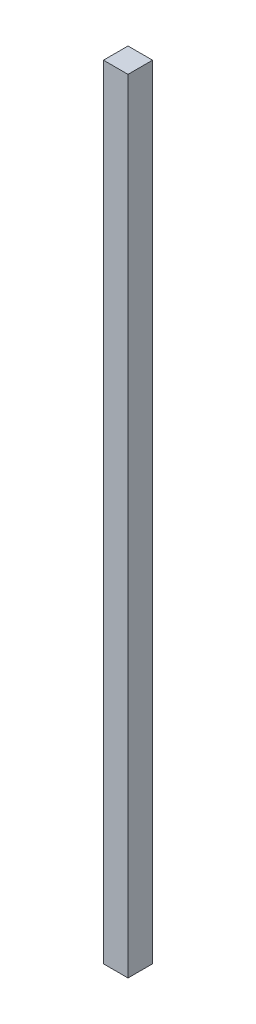
ISO-10303-21;
HEADER;
FILE_DESCRIPTION(('STEP AP214'),'2;1');
FILE_NAME('part.step','',(''),(''),'','','');
FILE_SCHEMA(('AUTOMOTIVE_DESIGN { 1 0 10303 214 1 1 1 1 }'));
ENDSEC;
DATA;
#1=APPLICATION_CONTEXT('core data for automotive mechanical design processes');
#2=APPLICATION_PROTOCOL_DEFINITION('international standard','automotive_design',2000,#1);
#3=PRODUCT_CONTEXT('',#1,'mechanical');
#4=PRODUCT('Part','Part','',(#3));
#5=PRODUCT_RELATED_PRODUCT_CATEGORY('part','',(#4));
#6=PRODUCT_DEFINITION_FORMATION('','',#4);
#7=PRODUCT_DEFINITION_CONTEXT('part definition',#1,'design');
#8=PRODUCT_DEFINITION('design','',#6,#7);
#9=PRODUCT_DEFINITION_SHAPE('','',#8);
#10=(LENGTH_UNIT() NAMED_UNIT(*) SI_UNIT(.MILLI.,.METRE.));
#11=(NAMED_UNIT(*) PLANE_ANGLE_UNIT() SI_UNIT($,.RADIAN.));
#12=(NAMED_UNIT(*) SI_UNIT($,.STERADIAN.) SOLID_ANGLE_UNIT());
#13=UNCERTAINTY_MEASURE_WITH_UNIT(LENGTH_MEASURE(1.E-05),#10,'distance_accuracy_value','');
#14=(GEOMETRIC_REPRESENTATION_CONTEXT(3) GLOBAL_UNCERTAINTY_ASSIGNED_CONTEXT((#13)) GLOBAL_UNIT_ASSIGNED_CONTEXT((#10,
#11,#12)) REPRESENTATION_CONTEXT('',''));
#15=CARTESIAN_POINT('',(0.,0.,0.));
#16=DIRECTION('',(0.,0.,1.));
#17=DIRECTION('',(1.,0.,0.));
#18=AXIS2_PLACEMENT_3D('',#15,#16,#17);
#19=CARTESIAN_POINT('',(0.,637.76,0.));
#20=DIRECTION('',(1.,0.,0.));
#21=DIRECTION('',(0.,0.,-1.));
#22=AXIS2_PLACEMENT_3D('',#19,#20,#21);
#23=PLANE('',#22);
#24=DIRECTION('',(0.,0.,1.));
#25=VECTOR('',#24,1.);
#26=CARTESIAN_POINT('',(0.,0.,0.));
#27=LINE('',#26,#25);
#28=CARTESIAN_POINT('',(0.,0.,0.));
#29=VERTEX_POINT('',#28);
#30=CARTESIAN_POINT('',(0.,0.,20.));
#31=VERTEX_POINT('',#30);
#32=EDGE_CURVE('E96',#29,#31,#27,.T.);
#33=ORIENTED_EDGE('',*,*,#32,.T.);
#34=DIRECTION('',(0.,-1.,0.));
#35=VECTOR('',#34,1.);
#36=CARTESIAN_POINT('',(0.,637.76,20.));
#37=LINE('',#36,#35);
#38=CARTESIAN_POINT('',(0.,637.76,20.));
#39=VERTEX_POINT('',#38);
#40=EDGE_CURVE('E11',#39,#31,#37,.T.);
#41=ORIENTED_EDGE('',*,*,#40,.F.);
#42=DIRECTION('',(0.,0.,1.));
#43=VECTOR('',#42,1.);
#44=CARTESIAN_POINT('',(0.,637.76,0.));
#45=LINE('',#44,#43);
#46=CARTESIAN_POINT('',(0.,637.76,0.));
#47=VERTEX_POINT('',#46);
#48=EDGE_CURVE('E84',#47,#39,#45,.T.);
#49=ORIENTED_EDGE('',*,*,#48,.F.);
#50=DIRECTION('',(0.,-1.,0.));
#51=VECTOR('',#50,1.);
#52=CARTESIAN_POINT('',(0.,637.76,0.));
#53=LINE('',#52,#51);
#54=EDGE_CURVE('E92',#47,#29,#53,.T.);
#55=ORIENTED_EDGE('',*,*,#54,.T.);
#56=EDGE_LOOP('',(#33,#41,#49,#55));
#57=FACE_BOUND('',#56,.T.);
#58=ADVANCED_FACE('F33',(#57),#23,.F.);
#59=CARTESIAN_POINT('',(0.,637.76,20.));
#60=DIRECTION('',(0.,0.,-1.));
#61=DIRECTION('',(-1.,0.,0.));
#62=AXIS2_PLACEMENT_3D('',#59,#60,#61);
#63=PLANE('',#62);
#64=DIRECTION('',(1.,0.,0.));
#65=VECTOR('',#64,1.);
#66=CARTESIAN_POINT('',(0.,0.,20.));
#67=LINE('',#66,#65);
#68=CARTESIAN_POINT('',(20.,0.,20.));
#69=VERTEX_POINT('',#68);
#70=EDGE_CURVE('E88',#31,#69,#67,.T.);
#71=ORIENTED_EDGE('',*,*,#70,.T.);
#72=DIRECTION('',(0.,-1.,0.));
#73=VECTOR('',#72,1.);
#74=CARTESIAN_POINT('',(20.,637.76,20.));
#75=LINE('',#74,#73);
#76=CARTESIAN_POINT('',(20.,637.76,20.));
#77=VERTEX_POINT('',#76);
#78=EDGE_CURVE('E41',#77,#69,#75,.T.);
#79=ORIENTED_EDGE('',*,*,#78,.F.);
#80=DIRECTION('',(1.,0.,0.));
#81=VECTOR('',#80,1.);
#82=CARTESIAN_POINT('',(0.,637.76,20.));
#83=LINE('',#82,#81);
#84=EDGE_CURVE('E79',#39,#77,#83,.T.);
#85=ORIENTED_EDGE('',*,*,#84,.F.);
#86=ORIENTED_EDGE('',*,*,#40,.T.);
#87=EDGE_LOOP('',(#71,#79,#85,#86));
#88=FACE_BOUND('',#87,.T.);
#89=ADVANCED_FACE('F87',(#88),#63,.F.);
#90=CARTESIAN_POINT('',(20.,637.76,0.));
#91=DIRECTION('',(-1.,0.,0.));
#92=DIRECTION('',(0.,0.,1.));
#93=AXIS2_PLACEMENT_3D('',#90,#91,#92);
#94=PLANE('',#93);
#95=DIRECTION('',(0.,0.,-1.));
#96=VECTOR('',#95,1.);
#97=CARTESIAN_POINT('',(20.,0.,0.));
#98=LINE('',#97,#96);
#99=CARTESIAN_POINT('',(20.,0.,0.));
#100=VERTEX_POINT('',#99);
#101=EDGE_CURVE('E66',#69,#100,#98,.T.);
#102=ORIENTED_EDGE('',*,*,#101,.T.);
#103=DIRECTION('',(0.,-1.,0.));
#104=VECTOR('',#103,1.);
#105=CARTESIAN_POINT('',(20.,637.76,0.));
#106=LINE('',#105,#104);
#107=CARTESIAN_POINT('',(20.,637.76,0.));
#108=VERTEX_POINT('',#107);
#109=EDGE_CURVE('E89',#108,#100,#106,.T.);
#110=ORIENTED_EDGE('',*,*,#109,.F.);
#111=DIRECTION('',(0.,0.,-1.));
#112=VECTOR('',#111,1.);
#113=CARTESIAN_POINT('',(20.,637.76,0.));
#114=LINE('',#113,#112);
#115=EDGE_CURVE('E82',#77,#108,#114,.T.);
#116=ORIENTED_EDGE('',*,*,#115,.F.);
#117=ORIENTED_EDGE('',*,*,#78,.T.);
#118=EDGE_LOOP('',(#102,#110,#116,#117));
#119=FACE_BOUND('',#118,.T.);
#120=ADVANCED_FACE('F90',(#119),#94,.F.);
#121=CARTESIAN_POINT('',(0.,637.76,0.));
#122=DIRECTION('',(0.,0.,1.));
#123=DIRECTION('',(1.,0.,0.));
#124=AXIS2_PLACEMENT_3D('',#121,#122,#123);
#125=PLANE('',#124);
#126=DIRECTION('',(-1.,0.,0.));
#127=VECTOR('',#126,1.);
#128=CARTESIAN_POINT('',(0.,0.,0.));
#129=LINE('',#128,#127);
#130=EDGE_CURVE('E72',#100,#29,#129,.T.);
#131=ORIENTED_EDGE('',*,*,#130,.T.);
#132=ORIENTED_EDGE('',*,*,#54,.F.);
#133=DIRECTION('',(-1.,0.,0.));
#134=VECTOR('',#133,1.);
#135=CARTESIAN_POINT('',(0.,637.76,0.));
#136=LINE('',#135,#134);
#137=EDGE_CURVE('E49',#108,#47,#136,.T.);
#138=ORIENTED_EDGE('',*,*,#137,.F.);
#139=ORIENTED_EDGE('',*,*,#109,.T.);
#140=EDGE_LOOP('',(#131,#132,#138,#139));
#141=FACE_BOUND('',#140,.T.);
#142=ADVANCED_FACE('F103',(#141),#125,.F.);
#143=CARTESIAN_POINT('',(0.,637.76,0.));
#144=DIRECTION('',(0.,1.,0.));
#145=DIRECTION('',(0.,0.,1.));
#146=AXIS2_PLACEMENT_3D('',#143,#144,#145);
#147=PLANE('',#146);
#148=ORIENTED_EDGE('',*,*,#48,.T.);
#149=ORIENTED_EDGE('',*,*,#84,.T.);
#150=ORIENTED_EDGE('',*,*,#115,.T.);
#151=ORIENTED_EDGE('',*,*,#137,.T.);
#152=EDGE_LOOP('',(#148,#149,#150,#151));
#153=FACE_BOUND('',#152,.T.);
#154=ADVANCED_FACE('F80',(#153),#147,.T.);
#155=CARTESIAN_POINT('',(0.,0.,0.));
#156=DIRECTION('',(0.,1.,0.));
#157=DIRECTION('',(0.,0.,1.));
#158=AXIS2_PLACEMENT_3D('',#155,#156,#157);
#159=PLANE('',#158);
#160=ORIENTED_EDGE('',*,*,#32,.F.);
#161=ORIENTED_EDGE('',*,*,#130,.F.);
#162=ORIENTED_EDGE('',*,*,#101,.F.);
#163=ORIENTED_EDGE('',*,*,#70,.F.);
#164=EDGE_LOOP('',(#160,#161,#162,#163));
#165=FACE_BOUND('',#164,.T.);
#166=ADVANCED_FACE('F106',(#165),#159,.F.);
#167=CLOSED_SHELL('',(#58,#89,#120,#142,#154,#166));
#168=MANIFOLD_SOLID_BREP('B2',#167);
#169=ADVANCED_BREP_SHAPE_REPRESENTATION('',(#18,#168),#14);
#170=SHAPE_DEFINITION_REPRESENTATION(#9,#169);
ENDSEC;
END-ISO-10303-21;
